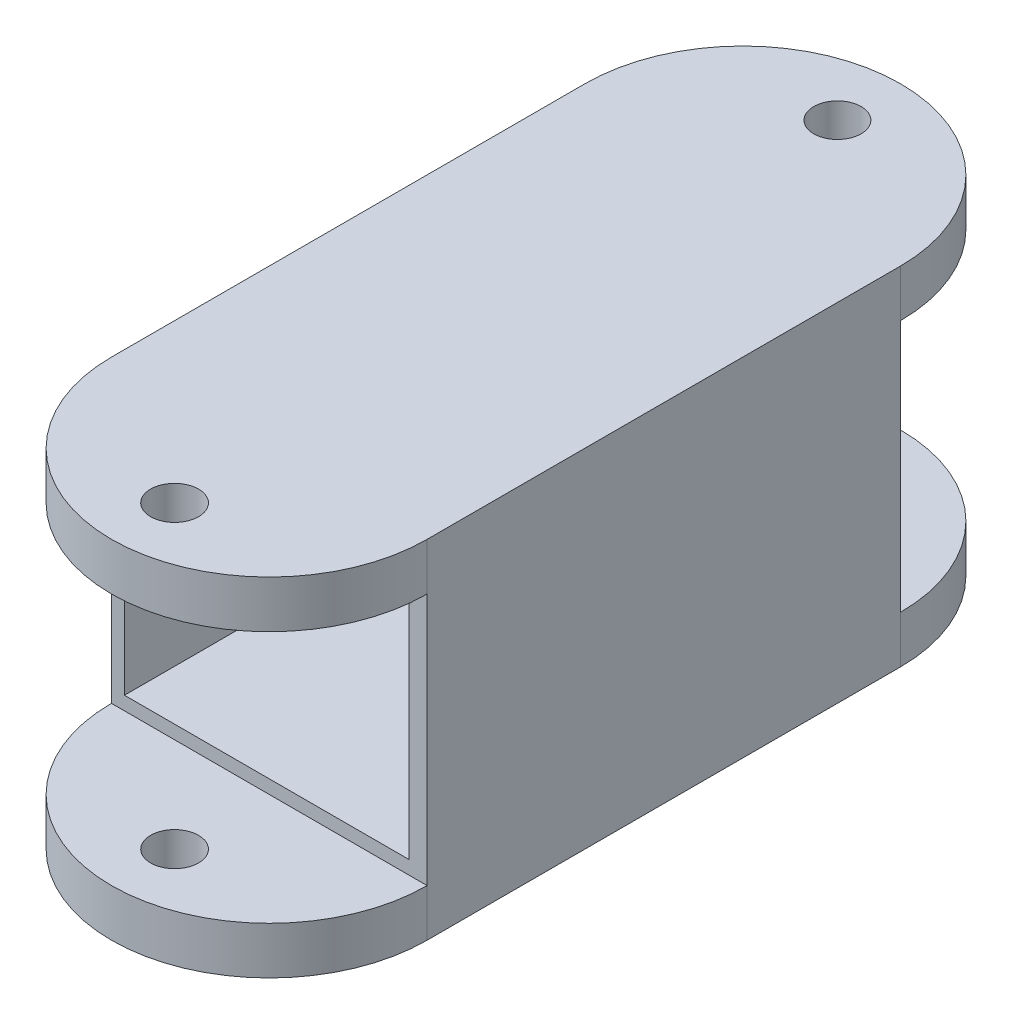
ISO-10303-21;
HEADER;
FILE_DESCRIPTION(('STEP AP214'),'2;1');
FILE_NAME('part.step','',(''),(''),'','','');
FILE_SCHEMA(('AUTOMOTIVE_DESIGN { 1 0 10303 214 1 1 1 1 }'));
ENDSEC;
DATA;
#1=APPLICATION_CONTEXT('core data for automotive mechanical design processes');
#2=APPLICATION_PROTOCOL_DEFINITION('international standard','automotive_design',2000,#1);
#3=PRODUCT_CONTEXT('',#1,'mechanical');
#4=PRODUCT('Part','Part','',(#3));
#5=PRODUCT_RELATED_PRODUCT_CATEGORY('part','',(#4));
#6=PRODUCT_DEFINITION_FORMATION('','',#4);
#7=PRODUCT_DEFINITION_CONTEXT('part definition',#1,'design');
#8=PRODUCT_DEFINITION('design','',#6,#7);
#9=PRODUCT_DEFINITION_SHAPE('','',#8);
#10=(LENGTH_UNIT() NAMED_UNIT(*) SI_UNIT(.MILLI.,.METRE.));
#11=(NAMED_UNIT(*) PLANE_ANGLE_UNIT() SI_UNIT($,.RADIAN.));
#12=(NAMED_UNIT(*) SI_UNIT($,.STERADIAN.) SOLID_ANGLE_UNIT());
#13=UNCERTAINTY_MEASURE_WITH_UNIT(LENGTH_MEASURE(1.E-05),#10,'distance_accuracy_value','');
#14=(GEOMETRIC_REPRESENTATION_CONTEXT(3) GLOBAL_UNCERTAINTY_ASSIGNED_CONTEXT((#13)) GLOBAL_UNIT_ASSIGNED_CONTEXT((#10,
#11,#12)) REPRESENTATION_CONTEXT('',''));
#15=CARTESIAN_POINT('',(0.,0.,0.));
#16=DIRECTION('',(0.,0.,1.));
#17=DIRECTION('',(1.,0.,0.));
#18=AXIS2_PLACEMENT_3D('',#15,#16,#17);
#19=CARTESIAN_POINT('',(0.,-5.5,-7.5));
#20=DIRECTION('',(0.,1.,0.));
#21=DIRECTION('',(0.,0.,1.));
#22=AXIS2_PLACEMENT_3D('',#19,#20,#21);
#23=PLANE('',#22);
#24=DIRECTION('',(0.,0.,-1.));
#25=VECTOR('',#24,1.);
#26=CARTESIAN_POINT('',(10.,-5.5,0.));
#27=LINE('',#26,#25);
#28=CARTESIAN_POINT('',(10.,-5.5,7.5));
#29=VERTEX_POINT('',#28);
#30=CARTESIAN_POINT('',(10.,-5.5,-7.5));
#31=VERTEX_POINT('',#30);
#32=EDGE_CURVE('E158',#29,#31,#27,.T.);
#33=ORIENTED_EDGE('',*,*,#32,.F.);
#34=CARTESIAN_POINT('',(5.,-5.5,7.5));
#35=DIRECTION('',(0.,1.,0.));
#36=DIRECTION('',(0.,0.,-1.));
#37=AXIS2_PLACEMENT_3D('',#34,#35,#36);
#38=CIRCLE('',#37,5.);
#39=CARTESIAN_POINT('',(0.,-5.5,7.5));
#40=VERTEX_POINT('',#39);
#41=EDGE_CURVE('E195',#40,#29,#38,.T.);
#42=ORIENTED_EDGE('',*,*,#41,.F.);
#43=DIRECTION('',(0.,0.,-1.));
#44=VECTOR('',#43,1.);
#45=CARTESIAN_POINT('',(0.,-5.5,0.));
#46=LINE('',#45,#44);
#47=CARTESIAN_POINT('',(0.,-5.5,-7.5));
#48=VERTEX_POINT('',#47);
#49=EDGE_CURVE('E162',#40,#48,#46,.T.);
#50=ORIENTED_EDGE('',*,*,#49,.T.);
#51=CARTESIAN_POINT('',(5.,-5.5,-7.5));
#52=DIRECTION('',(0.,1.,0.));
#53=DIRECTION('',(0.,0.,1.));
#54=AXIS2_PLACEMENT_3D('',#51,#52,#53);
#55=CIRCLE('',#54,5.);
#56=EDGE_CURVE('E227',#31,#48,#55,.T.);
#57=ORIENTED_EDGE('',*,*,#56,.F.);
#58=EDGE_LOOP('',(#33,#42,#50,#57));
#59=FACE_BOUND('',#58,.T.);
#60=CARTESIAN_POINT('',(5.,-5.5,10.5));
#61=DIRECTION('',(0.,1.,0.));
#62=DIRECTION('',(0.,0.,1.));
#63=AXIS2_PLACEMENT_3D('',#60,#61,#62);
#64=CIRCLE('',#63,0.759232067100159);
#65=CARTESIAN_POINT('',(5.,-5.5,11.2592320671002));
#66=VERTEX_POINT('',#65);
#67=EDGE_CURVE('E217',#66,#66,#64,.T.);
#68=ORIENTED_EDGE('',*,*,#67,.T.);
#69=EDGE_LOOP('',(#68));
#70=FACE_BOUND('',#69,.T.);
#71=CARTESIAN_POINT('',(5.,-5.5,-10.5));
#72=DIRECTION('',(0.,1.,0.));
#73=DIRECTION('',(0.,0.,1.));
#74=AXIS2_PLACEMENT_3D('',#71,#72,#73);
#75=CIRCLE('',#74,0.75);
#76=CARTESIAN_POINT('',(5.,-5.5,-9.75));
#77=VERTEX_POINT('',#76);
#78=EDGE_CURVE('E222',#77,#77,#75,.T.);
#79=ORIENTED_EDGE('',*,*,#78,.T.);
#80=EDGE_LOOP('',(#79));
#81=FACE_BOUND('',#80,.T.);
#82=ADVANCED_FACE('F33',(#59,#70,#81),#23,.F.);
#83=CARTESIAN_POINT('',(0.,-4.,-7.5));
#84=DIRECTION('',(0.,0.,-1.));
#85=DIRECTION('',(-1.,0.,0.));
#86=AXIS2_PLACEMENT_3D('',#83,#84,#85);
#87=PLANE('',#86);
#88=DIRECTION('',(0.,1.,0.));
#89=VECTOR('',#88,1.);
#90=CARTESIAN_POINT('',(0.413377968245723,-4.,-7.5));
#91=LINE('',#90,#89);
#92=CARTESIAN_POINT('',(0.413377968245723,-3.57079299116435,-7.5));
#93=VERTEX_POINT('',#92);
#94=CARTESIAN_POINT('',(0.413377968245723,3.55540164206461,-7.5));
#95=VERTEX_POINT('',#94);
#96=EDGE_CURVE('E155',#93,#95,#91,.T.);
#97=ORIENTED_EDGE('',*,*,#96,.F.);
#98=DIRECTION('',(-1.,0.,0.));
#99=VECTOR('',#98,1.);
#100=CARTESIAN_POINT('',(0.,-3.57079299116435,-7.5));
#101=LINE('',#100,#99);
#102=CARTESIAN_POINT('',(9.43270854075581,-3.57079299116435,-7.5));
#103=VERTEX_POINT('',#102);
#104=EDGE_CURVE('E148',#103,#93,#101,.T.);
#105=ORIENTED_EDGE('',*,*,#104,.F.);
#106=DIRECTION('',(0.,-1.,0.));
#107=VECTOR('',#106,1.);
#108=CARTESIAN_POINT('',(9.43270854075581,-4.,-7.5));
#109=LINE('',#108,#107);
#110=CARTESIAN_POINT('',(9.43270854075581,3.55540164206461,-7.5));
#111=VERTEX_POINT('',#110);
#112=EDGE_CURVE('E128',#111,#103,#109,.T.);
#113=ORIENTED_EDGE('',*,*,#112,.F.);
#114=DIRECTION('',(1.,0.,0.));
#115=VECTOR('',#114,1.);
#116=CARTESIAN_POINT('',(0.,3.55540164206461,-7.5));
#117=LINE('',#116,#115);
#118=EDGE_CURVE('E153',#95,#111,#117,.T.);
#119=ORIENTED_EDGE('',*,*,#118,.F.);
#120=EDGE_LOOP('',(#97,#105,#113,#119));
#121=FACE_BOUND('',#120,.T.);
#122=DIRECTION('',(0.,1.,0.));
#123=VECTOR('',#122,1.);
#124=CARTESIAN_POINT('',(10.,0.,-7.5));
#125=LINE('',#124,#123);
#126=CARTESIAN_POINT('',(10.,-4.,-7.5));
#127=VERTEX_POINT('',#126);
#128=CARTESIAN_POINT('',(10.,4.,-7.5));
#129=VERTEX_POINT('',#128);
#130=EDGE_CURVE('E161',#127,#129,#125,.T.);
#131=ORIENTED_EDGE('',*,*,#130,.F.);
#132=DIRECTION('',(1.,0.,0.));
#133=VECTOR('',#132,1.);
#134=CARTESIAN_POINT('',(5.,-4.,-7.5));
#135=LINE('',#134,#133);
#136=CARTESIAN_POINT('',(0.,-4.,-7.5));
#137=VERTEX_POINT('',#136);
#138=EDGE_CURVE('E169',#137,#127,#135,.T.);
#139=ORIENTED_EDGE('',*,*,#138,.F.);
#140=DIRECTION('',(0.,1.,0.));
#141=VECTOR('',#140,1.);
#142=CARTESIAN_POINT('',(0.,0.,-7.5));
#143=LINE('',#142,#141);
#144=CARTESIAN_POINT('',(0.,4.,-7.5));
#145=VERTEX_POINT('',#144);
#146=EDGE_CURVE('E175',#137,#145,#143,.T.);
#147=ORIENTED_EDGE('',*,*,#146,.T.);
#148=DIRECTION('',(1.,0.,0.));
#149=VECTOR('',#148,1.);
#150=CARTESIAN_POINT('',(5.,4.,-7.5));
#151=LINE('',#150,#149);
#152=EDGE_CURVE('E170',#145,#129,#151,.T.);
#153=ORIENTED_EDGE('',*,*,#152,.T.);
#154=EDGE_LOOP('',(#131,#139,#147,#153));
#155=FACE_BOUND('',#154,.T.);
#156=ADVANCED_FACE('F297',(#121,#155),#87,.T.);
#157=CARTESIAN_POINT('',(0.,5.5,-7.5));
#158=DIRECTION('',(0.,-1.,0.));
#159=DIRECTION('',(0.,0.,-1.));
#160=AXIS2_PLACEMENT_3D('',#157,#158,#159);
#161=PLANE('',#160);
#162=DIRECTION('',(0.,0.,1.));
#163=VECTOR('',#162,1.);
#164=CARTESIAN_POINT('',(10.,5.5,0.));
#165=LINE('',#164,#163);
#166=CARTESIAN_POINT('',(10.,5.5,-7.5));
#167=VERTEX_POINT('',#166);
#168=CARTESIAN_POINT('',(10.,5.5,7.5));
#169=VERTEX_POINT('',#168);
#170=EDGE_CURVE('E181',#167,#169,#165,.T.);
#171=ORIENTED_EDGE('',*,*,#170,.F.);
#172=CARTESIAN_POINT('',(5.,5.5,-7.5));
#173=DIRECTION('',(0.,-1.,0.));
#174=DIRECTION('',(0.,0.,1.));
#175=AXIS2_PLACEMENT_3D('',#172,#173,#174);
#176=CIRCLE('',#175,5.);
#177=CARTESIAN_POINT('',(0.,5.5,-7.5));
#178=VERTEX_POINT('',#177);
#179=EDGE_CURVE('E214',#178,#167,#176,.T.);
#180=ORIENTED_EDGE('',*,*,#179,.F.);
#181=DIRECTION('',(0.,0.,1.));
#182=VECTOR('',#181,1.);
#183=CARTESIAN_POINT('',(0.,5.5,0.));
#184=LINE('',#183,#182);
#185=CARTESIAN_POINT('',(0.,5.5,7.5));
#186=VERTEX_POINT('',#185);
#187=EDGE_CURVE('E185',#178,#186,#184,.T.);
#188=ORIENTED_EDGE('',*,*,#187,.T.);
#189=CARTESIAN_POINT('',(5.,5.5,7.5));
#190=DIRECTION('',(0.,-1.,0.));
#191=DIRECTION('',(0.,0.,-1.));
#192=AXIS2_PLACEMENT_3D('',#189,#190,#191);
#193=CIRCLE('',#192,5.);
#194=EDGE_CURVE('E207',#169,#186,#193,.T.);
#195=ORIENTED_EDGE('',*,*,#194,.F.);
#196=EDGE_LOOP('',(#171,#180,#188,#195));
#197=FACE_BOUND('',#196,.T.);
#198=CARTESIAN_POINT('',(5.,5.5,-10.5));
#199=DIRECTION('',(0.,1.,0.));
#200=DIRECTION('',(0.,0.,1.));
#201=AXIS2_PLACEMENT_3D('',#198,#199,#200);
#202=CIRCLE('',#201,0.75);
#203=CARTESIAN_POINT('',(5.,5.5,-9.75));
#204=VERTEX_POINT('',#203);
#205=EDGE_CURVE('E211',#204,#204,#202,.T.);
#206=ORIENTED_EDGE('',*,*,#205,.F.);
#207=EDGE_LOOP('',(#206));
#208=FACE_BOUND('',#207,.T.);
#209=CARTESIAN_POINT('',(5.,5.5,10.5));
#210=DIRECTION('',(0.,1.,0.));
#211=DIRECTION('',(0.,0.,1.));
#212=AXIS2_PLACEMENT_3D('',#209,#210,#211);
#213=CIRCLE('',#212,0.759232067100159);
#214=CARTESIAN_POINT('',(5.,5.5,11.2592320671002));
#215=VERTEX_POINT('',#214);
#216=EDGE_CURVE('E204',#215,#215,#213,.T.);
#217=ORIENTED_EDGE('',*,*,#216,.F.);
#218=EDGE_LOOP('',(#217));
#219=FACE_BOUND('',#218,.T.);
#220=ADVANCED_FACE('F287',(#197,#208,#219),#161,.F.);
#221=CARTESIAN_POINT('',(0.,-4.,7.5));
#222=DIRECTION('',(0.,0.,-1.));
#223=DIRECTION('',(-1.,0.,0.));
#224=AXIS2_PLACEMENT_3D('',#221,#222,#223);
#225=PLANE('',#224);
#226=DIRECTION('',(1.,0.,0.));
#227=VECTOR('',#226,1.);
#228=CARTESIAN_POINT('',(0.413377968245723,-3.57079299116435,7.5));
#229=LINE('',#228,#227);
#230=CARTESIAN_POINT('',(0.413377968245723,-3.57079299116435,7.5));
#231=VERTEX_POINT('',#230);
#232=CARTESIAN_POINT('',(9.43270854075581,-3.57079299116435,7.5));
#233=VERTEX_POINT('',#232);
#234=EDGE_CURVE('E134',#231,#233,#229,.T.);
#235=ORIENTED_EDGE('',*,*,#234,.F.);
#236=DIRECTION('',(0.,-1.,0.));
#237=VECTOR('',#236,1.);
#238=CARTESIAN_POINT('',(0.413377968245723,3.55540164206461,7.5));
#239=LINE('',#238,#237);
#240=CARTESIAN_POINT('',(0.413377968245723,3.55540164206461,7.5));
#241=VERTEX_POINT('',#240);
#242=EDGE_CURVE('E56',#241,#231,#239,.T.);
#243=ORIENTED_EDGE('',*,*,#242,.F.);
#244=DIRECTION('',(-1.,0.,0.));
#245=VECTOR('',#244,1.);
#246=CARTESIAN_POINT('',(0.413377968245723,3.55540164206461,7.5));
#247=LINE('',#246,#245);
#248=CARTESIAN_POINT('',(9.43270854075581,3.55540164206461,7.5));
#249=VERTEX_POINT('',#248);
#250=EDGE_CURVE('E141',#249,#241,#247,.T.);
#251=ORIENTED_EDGE('',*,*,#250,.F.);
#252=DIRECTION('',(0.,1.,0.));
#253=VECTOR('',#252,1.);
#254=CARTESIAN_POINT('',(9.43270854075581,3.55540164206461,7.5));
#255=LINE('',#254,#253);
#256=EDGE_CURVE('E125',#233,#249,#255,.T.);
#257=ORIENTED_EDGE('',*,*,#256,.F.);
#258=EDGE_LOOP('',(#235,#243,#251,#257));
#259=FACE_BOUND('',#258,.T.);
#260=DIRECTION('',(0.,-1.,0.));
#261=VECTOR('',#260,1.);
#262=CARTESIAN_POINT('',(10.,0.,7.5));
#263=LINE('',#262,#261);
#264=CARTESIAN_POINT('',(10.,4.,7.5));
#265=VERTEX_POINT('',#264);
#266=CARTESIAN_POINT('',(10.,-4.,7.5));
#267=VERTEX_POINT('',#266);
#268=EDGE_CURVE('E184',#265,#267,#263,.T.);
#269=ORIENTED_EDGE('',*,*,#268,.F.);
#270=DIRECTION('',(1.,0.,0.));
#271=VECTOR('',#270,1.);
#272=CARTESIAN_POINT('',(5.,4.,7.5));
#273=LINE('',#272,#271);
#274=CARTESIAN_POINT('',(0.,4.,7.5));
#275=VERTEX_POINT('',#274);
#276=EDGE_CURVE('E191',#275,#265,#273,.T.);
#277=ORIENTED_EDGE('',*,*,#276,.F.);
#278=DIRECTION('',(0.,-1.,0.));
#279=VECTOR('',#278,1.);
#280=CARTESIAN_POINT('',(0.,0.,7.5));
#281=LINE('',#280,#279);
#282=CARTESIAN_POINT('',(0.,-4.,7.5));
#283=VERTEX_POINT('',#282);
#284=EDGE_CURVE('E197',#275,#283,#281,.T.);
#285=ORIENTED_EDGE('',*,*,#284,.T.);
#286=DIRECTION('',(1.,0.,0.));
#287=VECTOR('',#286,1.);
#288=CARTESIAN_POINT('',(5.,-4.,7.5));
#289=LINE('',#288,#287);
#290=EDGE_CURVE('E192',#283,#267,#289,.T.);
#291=ORIENTED_EDGE('',*,*,#290,.T.);
#292=EDGE_LOOP('',(#269,#277,#285,#291));
#293=FACE_BOUND('',#292,.T.);
#294=ADVANCED_FACE('F138',(#259,#293),#225,.F.);
#295=CARTESIAN_POINT('',(5.,-4.5,10.5));
#296=DIRECTION('',(0.,1.,0.));
#297=DIRECTION('',(0.,0.,1.));
#298=AXIS2_PLACEMENT_3D('',#295,#296,#297);
#299=CYLINDRICAL_SURFACE('',#298,0.759232067100159);
#300=CARTESIAN_POINT('',(5.,4.,10.5));
#301=DIRECTION('',(0.,1.,0.));
#302=DIRECTION('',(0.,0.,1.));
#303=AXIS2_PLACEMENT_3D('',#300,#301,#302);
#304=CIRCLE('',#303,0.759232067100159);
#305=CARTESIAN_POINT('',(5.,4.,11.2592320671002));
#306=VERTEX_POINT('',#305);
#307=EDGE_CURVE('E203',#306,#306,#304,.T.);
#308=ORIENTED_EDGE('',*,*,#307,.F.);
#309=EDGE_LOOP('',(#308));
#310=FACE_BOUND('',#309,.T.);
#311=ORIENTED_EDGE('',*,*,#216,.T.);
#312=EDGE_LOOP('',(#311));
#313=FACE_BOUND('',#312,.T.);
#314=ADVANCED_FACE('F342',(#310,#313),#299,.F.);
#315=CARTESIAN_POINT('',(5.,-4.5,-10.5));
#316=DIRECTION('',(0.,1.,0.));
#317=DIRECTION('',(0.,0.,1.));
#318=AXIS2_PLACEMENT_3D('',#315,#316,#317);
#319=CYLINDRICAL_SURFACE('',#318,0.75);
#320=CARTESIAN_POINT('',(5.,4.,-10.5));
#321=DIRECTION('',(0.,1.,0.));
#322=DIRECTION('',(0.,0.,1.));
#323=AXIS2_PLACEMENT_3D('',#320,#321,#322);
#324=CIRCLE('',#323,0.75);
#325=CARTESIAN_POINT('',(5.,4.,-9.75));
#326=VERTEX_POINT('',#325);
#327=EDGE_CURVE('E210',#326,#326,#324,.T.);
#328=ORIENTED_EDGE('',*,*,#327,.F.);
#329=EDGE_LOOP('',(#328));
#330=FACE_BOUND('',#329,.T.);
#331=ORIENTED_EDGE('',*,*,#205,.T.);
#332=EDGE_LOOP('',(#331));
#333=FACE_BOUND('',#332,.T.);
#334=ADVANCED_FACE('F321',(#330,#333),#319,.F.);
#335=CARTESIAN_POINT('',(5.,-4.5,10.5));
#336=DIRECTION('',(0.,1.,0.));
#337=DIRECTION('',(0.,0.,1.));
#338=AXIS2_PLACEMENT_3D('',#335,#336,#337);
#339=CYLINDRICAL_SURFACE('',#338,0.759232067100159);
#340=ORIENTED_EDGE('',*,*,#67,.F.);
#341=EDGE_LOOP('',(#340));
#342=FACE_BOUND('',#341,.T.);
#343=CARTESIAN_POINT('',(5.,-4.,10.5));
#344=DIRECTION('',(0.,1.,0.));
#345=DIRECTION('',(0.,0.,1.));
#346=AXIS2_PLACEMENT_3D('',#343,#344,#345);
#347=CIRCLE('',#346,0.759232067100159);
#348=CARTESIAN_POINT('',(5.,-4.,11.2592320671002));
#349=VERTEX_POINT('',#348);
#350=EDGE_CURVE('E200',#349,#349,#347,.T.);
#351=ORIENTED_EDGE('',*,*,#350,.T.);
#352=EDGE_LOOP('',(#351));
#353=FACE_BOUND('',#352,.T.);
#354=ADVANCED_FACE('F313',(#342,#353),#339,.F.);
#355=CARTESIAN_POINT('',(5.,-4.5,-10.5));
#356=DIRECTION('',(0.,1.,0.));
#357=DIRECTION('',(0.,0.,1.));
#358=AXIS2_PLACEMENT_3D('',#355,#356,#357);
#359=CYLINDRICAL_SURFACE('',#358,0.75);
#360=ORIENTED_EDGE('',*,*,#78,.F.);
#361=EDGE_LOOP('',(#360));
#362=FACE_BOUND('',#361,.T.);
#363=CARTESIAN_POINT('',(5.,-4.,-10.5));
#364=DIRECTION('',(0.,1.,0.));
#365=DIRECTION('',(0.,0.,1.));
#366=AXIS2_PLACEMENT_3D('',#363,#364,#365);
#367=CIRCLE('',#366,0.75);
#368=CARTESIAN_POINT('',(5.,-4.,-9.75));
#369=VERTEX_POINT('',#368);
#370=EDGE_CURVE('E223',#369,#369,#367,.T.);
#371=ORIENTED_EDGE('',*,*,#370,.T.);
#372=EDGE_LOOP('',(#371));
#373=FACE_BOUND('',#372,.T.);
#374=ADVANCED_FACE('F311',(#362,#373),#359,.F.);
#375=CARTESIAN_POINT('',(5.,0.,-7.5));
#376=DIRECTION('',(0.,1.,0.));
#377=DIRECTION('',(0.,0.,1.));
#378=AXIS2_PLACEMENT_3D('',#375,#376,#377);
#379=CYLINDRICAL_SURFACE('',#378,5.);
#380=DIRECTION('',(0.,1.,0.));
#381=VECTOR('',#380,1.);
#382=CARTESIAN_POINT('',(0.,0.,-7.5));
#383=LINE('',#382,#381);
#384=EDGE_CURVE('E166',#48,#137,#383,.T.);
#385=ORIENTED_EDGE('',*,*,#384,.T.);
#386=CARTESIAN_POINT('',(5.,-4.,-7.5));
#387=DIRECTION('',(0.,-1.,0.));
#388=DIRECTION('',(0.,0.,1.));
#389=AXIS2_PLACEMENT_3D('',#386,#387,#388);
#390=CIRCLE('',#389,5.);
#391=EDGE_CURVE('E226',#137,#127,#390,.T.);
#392=ORIENTED_EDGE('',*,*,#391,.T.);
#393=DIRECTION('',(0.,1.,0.));
#394=VECTOR('',#393,1.);
#395=CARTESIAN_POINT('',(10.,0.,-7.5));
#396=LINE('',#395,#394);
#397=EDGE_CURVE('E234',#31,#127,#396,.T.);
#398=ORIENTED_EDGE('',*,*,#397,.F.);
#399=ORIENTED_EDGE('',*,*,#56,.T.);
#400=EDGE_LOOP('',(#385,#392,#398,#399));
#401=FACE_BOUND('',#400,.T.);
#402=ADVANCED_FACE('F302',(#401),#379,.T.);
#403=CARTESIAN_POINT('',(0.,-4.,-12.5));
#404=DIRECTION('',(0.,1.,0.));
#405=DIRECTION('',(0.,0.,1.));
#406=AXIS2_PLACEMENT_3D('',#403,#404,#405);
#407=PLANE('',#406);
#408=ORIENTED_EDGE('',*,*,#391,.F.);
#409=ORIENTED_EDGE('',*,*,#138,.T.);
#410=EDGE_LOOP('',(#408,#409));
#411=FACE_BOUND('',#410,.T.);
#412=ORIENTED_EDGE('',*,*,#370,.F.);
#413=EDGE_LOOP('',(#412));
#414=FACE_BOUND('',#413,.T.);
#415=ADVANCED_FACE('F305',(#411,#414),#407,.T.);
#416=CARTESIAN_POINT('',(5.,0.,-7.5));
#417=DIRECTION('',(0.,1.,0.));
#418=DIRECTION('',(0.,0.,1.));
#419=AXIS2_PLACEMENT_3D('',#416,#417,#418);
#420=CYLINDRICAL_SURFACE('',#419,5.);
#421=DIRECTION('',(0.,1.,0.));
#422=VECTOR('',#421,1.);
#423=CARTESIAN_POINT('',(0.,0.,-7.5));
#424=LINE('',#423,#422);
#425=EDGE_CURVE('E178',#145,#178,#424,.T.);
#426=ORIENTED_EDGE('',*,*,#425,.T.);
#427=ORIENTED_EDGE('',*,*,#179,.T.);
#428=DIRECTION('',(0.,1.,0.));
#429=VECTOR('',#428,1.);
#430=CARTESIAN_POINT('',(10.,0.,-7.5));
#431=LINE('',#430,#429);
#432=EDGE_CURVE('E174',#129,#167,#431,.T.);
#433=ORIENTED_EDGE('',*,*,#432,.F.);
#434=CARTESIAN_POINT('',(5.,4.,-7.5));
#435=DIRECTION('',(0.,1.,0.));
#436=DIRECTION('',(0.,0.,1.));
#437=AXIS2_PLACEMENT_3D('',#434,#435,#436);
#438=CIRCLE('',#437,5.);
#439=EDGE_CURVE('E173',#129,#145,#438,.T.);
#440=ORIENTED_EDGE('',*,*,#439,.T.);
#441=EDGE_LOOP('',(#426,#427,#433,#440));
#442=FACE_BOUND('',#441,.T.);
#443=ADVANCED_FACE('F290',(#442),#420,.T.);
#444=CARTESIAN_POINT('',(0.,4.,-12.5));
#445=DIRECTION('',(0.,1.,0.));
#446=DIRECTION('',(0.,0.,1.));
#447=AXIS2_PLACEMENT_3D('',#444,#445,#446);
#448=PLANE('',#447);
#449=ORIENTED_EDGE('',*,*,#439,.F.);
#450=ORIENTED_EDGE('',*,*,#152,.F.);
#451=EDGE_LOOP('',(#449,#450));
#452=FACE_BOUND('',#451,.T.);
#453=ORIENTED_EDGE('',*,*,#327,.T.);
#454=EDGE_LOOP('',(#453));
#455=FACE_BOUND('',#454,.T.);
#456=ADVANCED_FACE('F293',(#452,#455),#448,.F.);
#457=CARTESIAN_POINT('',(5.,0.,7.5));
#458=DIRECTION('',(0.,-1.,0.));
#459=DIRECTION('',(0.,0.,-1.));
#460=AXIS2_PLACEMENT_3D('',#457,#458,#459);
#461=CYLINDRICAL_SURFACE('',#460,5.);
#462=ORIENTED_EDGE('',*,*,#41,.T.);
#463=DIRECTION('',(0.,-1.,0.));
#464=VECTOR('',#463,1.);
#465=CARTESIAN_POINT('',(10.,0.,7.5));
#466=LINE('',#465,#464);
#467=EDGE_CURVE('E245',#267,#29,#466,.T.);
#468=ORIENTED_EDGE('',*,*,#467,.F.);
#469=CARTESIAN_POINT('',(5.,-4.,7.5));
#470=DIRECTION('',(0.,-1.,0.));
#471=DIRECTION('',(0.,0.,-1.));
#472=AXIS2_PLACEMENT_3D('',#469,#470,#471);
#473=CIRCLE('',#472,5.);
#474=EDGE_CURVE('E196',#267,#283,#473,.T.);
#475=ORIENTED_EDGE('',*,*,#474,.T.);
#476=DIRECTION('',(0.,-1.,0.));
#477=VECTOR('',#476,1.);
#478=CARTESIAN_POINT('',(0.,0.,7.5));
#479=LINE('',#478,#477);
#480=EDGE_CURVE('E165',#283,#40,#479,.T.);
#481=ORIENTED_EDGE('',*,*,#480,.T.);
#482=EDGE_LOOP('',(#462,#468,#475,#481));
#483=FACE_BOUND('',#482,.T.);
#484=ADVANCED_FACE('F357',(#483),#461,.T.);
#485=CARTESIAN_POINT('',(0.,-4.,-12.5));
#486=DIRECTION('',(0.,1.,0.));
#487=DIRECTION('',(0.,0.,1.));
#488=AXIS2_PLACEMENT_3D('',#485,#486,#487);
#489=PLANE('',#488);
#490=ORIENTED_EDGE('',*,*,#474,.F.);
#491=ORIENTED_EDGE('',*,*,#290,.F.);
#492=EDGE_LOOP('',(#490,#491));
#493=FACE_BOUND('',#492,.T.);
#494=ORIENTED_EDGE('',*,*,#350,.F.);
#495=EDGE_LOOP('',(#494));
#496=FACE_BOUND('',#495,.T.);
#497=ADVANCED_FACE('F267',(#493,#496),#489,.T.);
#498=CARTESIAN_POINT('',(0.,0.,0.));
#499=DIRECTION('',(1.,0.,0.));
#500=DIRECTION('',(0.,0.,-1.));
#501=AXIS2_PLACEMENT_3D('',#498,#499,#500);
#502=PLANE('',#501);
#503=CARTESIAN_POINT('',(0.,0.,0.));
#504=DIRECTION('',(1.,0.,0.));
#505=DIRECTION('',(0.,0.,-1.));
#506=AXIS2_PLACEMENT_3D('',#503,#504,#505);
#507=CIRCLE('',#506,1.96896758701895);
#508=CARTESIAN_POINT('',(0.,0.,-1.96896758701895));
#509=VERTEX_POINT('',#508);
#510=EDGE_CURVE('E41',#509,#509,#507,.F.);
#511=ORIENTED_EDGE('',*,*,#510,.F.);
#512=EDGE_LOOP('',(#511));
#513=FACE_BOUND('',#512,.T.);
#514=ORIENTED_EDGE('',*,*,#284,.F.);
#515=DIRECTION('',(0.,-1.,0.));
#516=VECTOR('',#515,1.);
#517=CARTESIAN_POINT('',(0.,4.75,7.5));
#518=LINE('',#517,#516);
#519=EDGE_CURVE('E188',#186,#275,#518,.T.);
#520=ORIENTED_EDGE('',*,*,#519,.F.);
#521=ORIENTED_EDGE('',*,*,#187,.F.);
#522=ORIENTED_EDGE('',*,*,#425,.F.);
#523=ORIENTED_EDGE('',*,*,#146,.F.);
#524=ORIENTED_EDGE('',*,*,#384,.F.);
#525=ORIENTED_EDGE('',*,*,#49,.F.);
#526=ORIENTED_EDGE('',*,*,#480,.F.);
#527=EDGE_LOOP('',(#514,#520,#521,#522,#523,#524,#525,#526));
#528=FACE_BOUND('',#527,.T.);
#529=ADVANCED_FACE('F263',(#513,#528),#502,.F.);
#530=CARTESIAN_POINT('',(5.,0.,7.5));
#531=DIRECTION('',(0.,-1.,0.));
#532=DIRECTION('',(0.,0.,-1.));
#533=AXIS2_PLACEMENT_3D('',#530,#531,#532);
#534=CYLINDRICAL_SURFACE('',#533,5.);
#535=ORIENTED_EDGE('',*,*,#519,.T.);
#536=CARTESIAN_POINT('',(5.,4.,7.5));
#537=DIRECTION('',(0.,1.,0.));
#538=DIRECTION('',(0.,0.,-1.));
#539=AXIS2_PLACEMENT_3D('',#536,#537,#538);
#540=CIRCLE('',#539,5.);
#541=EDGE_CURVE('E253',#275,#265,#540,.T.);
#542=ORIENTED_EDGE('',*,*,#541,.T.);
#543=DIRECTION('',(0.,-1.,0.));
#544=VECTOR('',#543,1.);
#545=CARTESIAN_POINT('',(10.,4.75,7.5));
#546=LINE('',#545,#544);
#547=EDGE_CURVE('E157',#169,#265,#546,.T.);
#548=ORIENTED_EDGE('',*,*,#547,.F.);
#549=ORIENTED_EDGE('',*,*,#194,.T.);
#550=EDGE_LOOP('',(#535,#542,#548,#549));
#551=FACE_BOUND('',#550,.T.);
#552=ADVANCED_FACE('F266',(#551),#534,.T.);
#553=CARTESIAN_POINT('',(10.,0.,0.));
#554=DIRECTION('',(1.,0.,0.));
#555=DIRECTION('',(0.,0.,-1.));
#556=AXIS2_PLACEMENT_3D('',#553,#554,#555);
#557=PLANE('',#556);
#558=ORIENTED_EDGE('',*,*,#547,.T.);
#559=ORIENTED_EDGE('',*,*,#268,.T.);
#560=ORIENTED_EDGE('',*,*,#467,.T.);
#561=ORIENTED_EDGE('',*,*,#32,.T.);
#562=ORIENTED_EDGE('',*,*,#397,.T.);
#563=ORIENTED_EDGE('',*,*,#130,.T.);
#564=ORIENTED_EDGE('',*,*,#432,.T.);
#565=ORIENTED_EDGE('',*,*,#170,.T.);
#566=EDGE_LOOP('',(#558,#559,#560,#561,#562,#563,#564,#565));
#567=FACE_BOUND('',#566,.T.);
#568=ADVANCED_FACE('F281',(#567),#557,.T.);
#569=CARTESIAN_POINT('',(0.,4.,-12.5));
#570=DIRECTION('',(0.,1.,0.));
#571=DIRECTION('',(0.,0.,1.));
#572=AXIS2_PLACEMENT_3D('',#569,#570,#571);
#573=PLANE('',#572);
#574=ORIENTED_EDGE('',*,*,#276,.T.);
#575=ORIENTED_EDGE('',*,*,#541,.F.);
#576=EDGE_LOOP('',(#574,#575));
#577=FACE_BOUND('',#576,.T.);
#578=ORIENTED_EDGE('',*,*,#307,.T.);
#579=EDGE_LOOP('',(#578));
#580=FACE_BOUND('',#579,.T.);
#581=ADVANCED_FACE('F35',(#577,#580),#573,.F.);
#582=CARTESIAN_POINT('',(0.413377968245723,3.55540164206461,-10.5));
#583=DIRECTION('',(-1.,0.,0.));
#584=DIRECTION('',(0.,0.,1.));
#585=AXIS2_PLACEMENT_3D('',#582,#583,#584);
#586=PLANE('',#585);
#587=ORIENTED_EDGE('',*,*,#96,.T.);
#588=DIRECTION('',(0.,0.,1.));
#589=VECTOR('',#588,1.);
#590=CARTESIAN_POINT('',(0.413377968245723,3.55540164206461,-10.5));
#591=LINE('',#590,#589);
#592=EDGE_CURVE('E146',#95,#241,#591,.T.);
#593=ORIENTED_EDGE('',*,*,#592,.T.);
#594=ORIENTED_EDGE('',*,*,#242,.T.);
#595=DIRECTION('',(0.,0.,1.));
#596=VECTOR('',#595,1.);
#597=CARTESIAN_POINT('',(0.413377968245723,-3.57079299116435,-10.5));
#598=LINE('',#597,#596);
#599=EDGE_CURVE('E131',#93,#231,#598,.T.);
#600=ORIENTED_EDGE('',*,*,#599,.F.);
#601=EDGE_LOOP('',(#587,#593,#594,#600));
#602=FACE_BOUND('',#601,.T.);
#603=ADVANCED_FACE('F335',(#602),#586,.F.);
#604=CARTESIAN_POINT('',(0.413377968245723,3.55540164206461,-10.5));
#605=DIRECTION('',(0.,1.,0.));
#606=DIRECTION('',(0.,0.,1.));
#607=AXIS2_PLACEMENT_3D('',#604,#605,#606);
#608=PLANE('',#607);
#609=ORIENTED_EDGE('',*,*,#118,.T.);
#610=DIRECTION('',(0.,0.,1.));
#611=VECTOR('',#610,1.);
#612=CARTESIAN_POINT('',(9.43270854075581,3.55540164206461,-10.5));
#613=LINE('',#612,#611);
#614=EDGE_CURVE('E130',#111,#249,#613,.T.);
#615=ORIENTED_EDGE('',*,*,#614,.T.);
#616=ORIENTED_EDGE('',*,*,#250,.T.);
#617=ORIENTED_EDGE('',*,*,#592,.F.);
#618=EDGE_LOOP('',(#609,#615,#616,#617));
#619=FACE_BOUND('',#618,.T.);
#620=ADVANCED_FACE('F378',(#619),#608,.F.);
#621=CARTESIAN_POINT('',(9.43270854075581,3.55540164206461,-10.5));
#622=DIRECTION('',(1.,0.,0.));
#623=DIRECTION('',(0.,0.,-1.));
#624=AXIS2_PLACEMENT_3D('',#621,#622,#623);
#625=PLANE('',#624);
#626=CARTESIAN_POINT('',(9.43270854075581,0.,0.));
#627=DIRECTION('',(1.,0.,0.));
#628=DIRECTION('',(0.,0.,-1.));
#629=AXIS2_PLACEMENT_3D('',#626,#627,#628);
#630=CIRCLE('',#629,1.97156700394495);
#631=CARTESIAN_POINT('',(9.43270854075581,0.,-1.97156700394495));
#632=VERTEX_POINT('',#631);
#633=EDGE_CURVE('E11',#632,#632,#630,.F.);
#634=ORIENTED_EDGE('',*,*,#633,.F.);
#635=EDGE_LOOP('',(#634));
#636=FACE_BOUND('',#635,.T.);
#637=ORIENTED_EDGE('',*,*,#112,.T.);
#638=DIRECTION('',(0.,0.,1.));
#639=VECTOR('',#638,1.);
#640=CARTESIAN_POINT('',(9.43270854075581,-3.57079299116435,-10.5));
#641=LINE('',#640,#639);
#642=EDGE_CURVE('E48',#103,#233,#641,.T.);
#643=ORIENTED_EDGE('',*,*,#642,.T.);
#644=ORIENTED_EDGE('',*,*,#256,.T.);
#645=ORIENTED_EDGE('',*,*,#614,.F.);
#646=EDGE_LOOP('',(#637,#643,#644,#645));
#647=FACE_BOUND('',#646,.T.);
#648=ADVANCED_FACE('F122',(#636,#647),#625,.F.);
#649=CARTESIAN_POINT('',(0.413377968245723,-3.57079299116435,-10.5));
#650=DIRECTION('',(0.,-1.,0.));
#651=DIRECTION('',(0.,0.,-1.));
#652=AXIS2_PLACEMENT_3D('',#649,#650,#651);
#653=PLANE('',#652);
#654=ORIENTED_EDGE('',*,*,#104,.T.);
#655=ORIENTED_EDGE('',*,*,#599,.T.);
#656=ORIENTED_EDGE('',*,*,#234,.T.);
#657=ORIENTED_EDGE('',*,*,#642,.F.);
#658=EDGE_LOOP('',(#654,#655,#656,#657));
#659=FACE_BOUND('',#658,.T.);
#660=ADVANCED_FACE('F135',(#659),#653,.F.);
#661=CARTESIAN_POINT('',(-3.,0.,0.));
#662=DIRECTION('',(1.,0.,0.));
#663=DIRECTION('',(0.,0.,-1.));
#664=AXIS2_PLACEMENT_3D('',#661,#662,#663);
#665=CYLINDRICAL_SURFACE('',#664,1.96896758701895);
#666=CARTESIAN_POINT('',(-3.,0.,0.));
#667=DIRECTION('',(-1.,0.,0.));
#668=DIRECTION('',(0.,0.,1.));
#669=AXIS2_PLACEMENT_3D('',#666,#667,#668);
#670=CIRCLE('',#669,1.96896758701895);
#671=CARTESIAN_POINT('',(-3.,0.,1.96896758701895));
#672=VERTEX_POINT('',#671);
#673=EDGE_CURVE('E387',#672,#672,#670,.T.);
#674=ORIENTED_EDGE('',*,*,#673,.F.);
#675=EDGE_LOOP('',(#674));
#676=FACE_BOUND('',#675,.T.);
#677=ORIENTED_EDGE('',*,*,#510,.T.);
#678=EDGE_LOOP('',(#677));
#679=FACE_BOUND('',#678,.T.);
#680=ADVANCED_FACE('F261',(#676,#679),#665,.T.);
#681=CARTESIAN_POINT('',(-3.,0.,0.));
#682=DIRECTION('',(-1.,0.,0.));
#683=DIRECTION('',(0.,0.,1.));
#684=AXIS2_PLACEMENT_3D('',#681,#682,#683);
#685=PLANE('',#684);
#686=ORIENTED_EDGE('',*,*,#673,.T.);
#687=EDGE_LOOP('',(#686));
#688=FACE_BOUND('',#687,.T.);
#689=ADVANCED_FACE('F400',(#688),#685,.T.);
#690=CARTESIAN_POINT('',(6.43270854075581,0.,0.));
#691=DIRECTION('',(1.,0.,0.));
#692=DIRECTION('',(0.,0.,-1.));
#693=AXIS2_PLACEMENT_3D('',#690,#691,#692);
#694=CYLINDRICAL_SURFACE('',#693,1.97156700394495);
#695=CARTESIAN_POINT('',(6.43270854075581,0.,0.));
#696=DIRECTION('',(-1.,0.,0.));
#697=DIRECTION('',(0.,0.,1.));
#698=AXIS2_PLACEMENT_3D('',#695,#696,#697);
#699=CIRCLE('',#698,1.97156700394495);
#700=CARTESIAN_POINT('',(6.43270854075581,0.,1.97156700394495));
#701=VERTEX_POINT('',#700);
#702=EDGE_CURVE('E389',#701,#701,#699,.T.);
#703=ORIENTED_EDGE('',*,*,#702,.F.);
#704=EDGE_LOOP('',(#703));
#705=FACE_BOUND('',#704,.T.);
#706=ORIENTED_EDGE('',*,*,#633,.T.);
#707=EDGE_LOOP('',(#706));
#708=FACE_BOUND('',#707,.T.);
#709=ADVANCED_FACE('F397',(#705,#708),#694,.T.);
#710=CARTESIAN_POINT('',(6.43270854075581,0.,0.));
#711=DIRECTION('',(-1.,0.,0.));
#712=DIRECTION('',(0.,0.,1.));
#713=AXIS2_PLACEMENT_3D('',#710,#711,#712);
#714=PLANE('',#713);
#715=ORIENTED_EDGE('',*,*,#702,.T.);
#716=EDGE_LOOP('',(#715));
#717=FACE_BOUND('',#716,.T.);
#718=ADVANCED_FACE('F395',(#717),#714,.T.);
#719=CLOSED_SHELL('',(#82,#156,#220,#294,#314,#334,#354,#374,#402,#415,#443,#456,#484,#497,#529,
#552,#568,#581,#603,#620,#648,#660,#680,#689,#709,#718));
#720=MANIFOLD_SOLID_BREP('B2',#719);
#721=ADVANCED_BREP_SHAPE_REPRESENTATION('',(#18,#720),#14);
#722=SHAPE_DEFINITION_REPRESENTATION(#9,#721);
ENDSEC;
END-ISO-10303-21;
